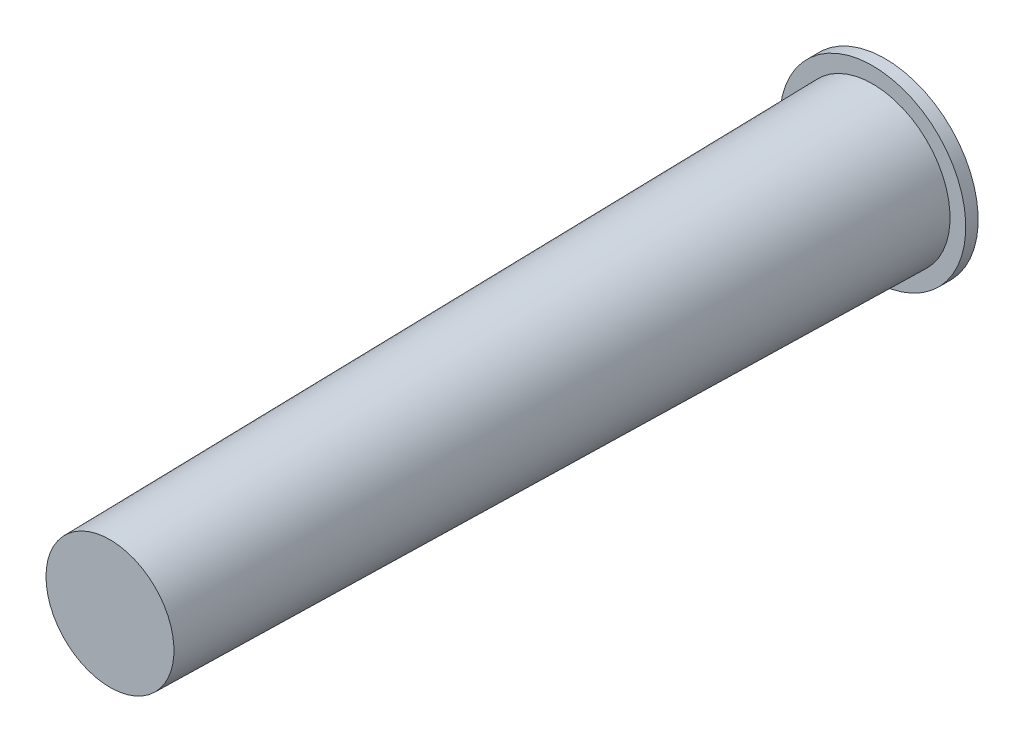
ISO-10303-21;
HEADER;
FILE_DESCRIPTION(('STEP AP214'),'2;1');
FILE_NAME('part.step','',(''),(''),'','','');
FILE_SCHEMA(('AUTOMOTIVE_DESIGN { 1 0 10303 214 1 1 1 1 }'));
ENDSEC;
DATA;
#1=APPLICATION_CONTEXT('core data for automotive mechanical design processes');
#2=APPLICATION_PROTOCOL_DEFINITION('international standard','automotive_design',2000,#1);
#3=PRODUCT_CONTEXT('',#1,'mechanical');
#4=PRODUCT('Part','Part','',(#3));
#5=PRODUCT_RELATED_PRODUCT_CATEGORY('part','',(#4));
#6=PRODUCT_DEFINITION_FORMATION('','',#4);
#7=PRODUCT_DEFINITION_CONTEXT('part definition',#1,'design');
#8=PRODUCT_DEFINITION('design','',#6,#7);
#9=PRODUCT_DEFINITION_SHAPE('','',#8);
#10=(LENGTH_UNIT() NAMED_UNIT(*) SI_UNIT(.MILLI.,.METRE.));
#11=(NAMED_UNIT(*) PLANE_ANGLE_UNIT() SI_UNIT($,.RADIAN.));
#12=(NAMED_UNIT(*) SI_UNIT($,.STERADIAN.) SOLID_ANGLE_UNIT());
#13=UNCERTAINTY_MEASURE_WITH_UNIT(LENGTH_MEASURE(1.E-05),#10,'distance_accuracy_value','');
#14=(GEOMETRIC_REPRESENTATION_CONTEXT(3) GLOBAL_UNCERTAINTY_ASSIGNED_CONTEXT((#13)) GLOBAL_UNIT_ASSIGNED_CONTEXT((#10,
#11,#12)) REPRESENTATION_CONTEXT('',''));
#15=CARTESIAN_POINT('',(0.,0.,0.));
#16=DIRECTION('',(0.,0.,1.));
#17=DIRECTION('',(1.,0.,0.));
#18=AXIS2_PLACEMENT_3D('',#15,#16,#17);
#19=CARTESIAN_POINT('',(0.,0.,47.));
#20=DIRECTION('',(0.,0.,1.));
#21=DIRECTION('',(1.,0.,0.));
#22=AXIS2_PLACEMENT_3D('',#19,#20,#21);
#23=PLANE('',#22);
#24=CARTESIAN_POINT('',(0.,0.,47.));
#25=DIRECTION('',(0.,0.,1.));
#26=DIRECTION('',(1.,0.,0.));
#27=AXIS2_PLACEMENT_3D('',#24,#25,#26);
#28=CIRCLE('',#27,3.2);
#29=CARTESIAN_POINT('',(3.2,0.,47.));
#30=VERTEX_POINT('',#29);
#31=EDGE_CURVE('E17',#30,#30,#28,.F.);
#32=ORIENTED_EDGE('',*,*,#31,.T.);
#33=EDGE_LOOP('',(#32));
#34=FACE_BOUND('',#33,.T.);
#35=ADVANCED_FACE('F14',(#34),#23,.F.);
#36=CARTESIAN_POINT('',(0.,0.,5.94903320081219));
#37=DIRECTION('',(0.,0.,1.));
#38=DIRECTION('',(1.,0.,0.));
#39=AXIS2_PLACEMENT_3D('',#36,#37,#38);
#40=CYLINDRICAL_SURFACE('',#39,3.2);
#41=CARTESIAN_POINT('',(0.,0.,18.));
#42=DIRECTION('',(0.,0.,1.));
#43=DIRECTION('',(1.,0.,0.));
#44=AXIS2_PLACEMENT_3D('',#41,#42,#43);
#45=CIRCLE('',#44,3.2);
#46=CARTESIAN_POINT('',(3.2,0.,18.));
#47=VERTEX_POINT('',#46);
#48=EDGE_CURVE('E45',#47,#47,#45,.T.);
#49=ORIENTED_EDGE('',*,*,#48,.F.);
#50=EDGE_LOOP('',(#49));
#51=FACE_BOUND('',#50,.T.);
#52=ORIENTED_EDGE('',*,*,#31,.F.);
#53=EDGE_LOOP('',(#52));
#54=FACE_BOUND('',#53,.T.);
#55=ADVANCED_FACE('F53',(#51,#54),#40,.F.);
#56=CARTESIAN_POINT('',(0.,0.,18.));
#57=DIRECTION('',(0.,0.,1.));
#58=DIRECTION('',(1.,0.,0.));
#59=AXIS2_PLACEMENT_3D('',#56,#57,#58);
#60=PLANE('',#59);
#61=ORIENTED_EDGE('',*,*,#48,.T.);
#62=EDGE_LOOP('',(#61));
#63=FACE_BOUND('',#62,.T.);
#64=CARTESIAN_POINT('',(0.,0.,18.));
#65=DIRECTION('',(0.,0.,-1.));
#66=DIRECTION('',(-1.,0.,0.));
#67=AXIS2_PLACEMENT_3D('',#64,#65,#66);
#68=CIRCLE('',#67,1.);
#69=CARTESIAN_POINT('',(-1.,0.,18.));
#70=VERTEX_POINT('',#69);
#71=EDGE_CURVE('E43',#70,#70,#68,.T.);
#72=ORIENTED_EDGE('',*,*,#71,.T.);
#73=EDGE_LOOP('',(#72));
#74=FACE_BOUND('',#73,.T.);
#75=ADVANCED_FACE('F55',(#63,#74),#60,.T.);
#76=CARTESIAN_POINT('',(0.,0.,28.5));
#77=DIRECTION('',(0.,0.,-1.));
#78=DIRECTION('',(-1.,0.,0.));
#79=AXIS2_PLACEMENT_3D('',#76,#77,#78);
#80=CYLINDRICAL_SURFACE('',#79,1.);
#81=CARTESIAN_POINT('',(0.,0.,15.));
#82=DIRECTION('',(0.,0.,-1.));
#83=DIRECTION('',(-1.,0.,0.));
#84=AXIS2_PLACEMENT_3D('',#81,#82,#83);
#85=CIRCLE('',#84,1.);
#86=CARTESIAN_POINT('',(-1.,0.,15.));
#87=VERTEX_POINT('',#86);
#88=EDGE_CURVE('E40',#87,#87,#85,.T.);
#89=ORIENTED_EDGE('',*,*,#88,.T.);
#90=EDGE_LOOP('',(#89));
#91=FACE_BOUND('',#90,.T.);
#92=ORIENTED_EDGE('',*,*,#71,.F.);
#93=EDGE_LOOP('',(#92));
#94=FACE_BOUND('',#93,.T.);
#95=ADVANCED_FACE('F62',(#91,#94),#80,.F.);
#96=CARTESIAN_POINT('',(0.,0.,15.));
#97=DIRECTION('',(0.,0.,1.));
#98=DIRECTION('',(1.,0.,0.));
#99=AXIS2_PLACEMENT_3D('',#96,#97,#98);
#100=PLANE('',#99);
#101=ORIENTED_EDGE('',*,*,#88,.F.);
#102=EDGE_LOOP('',(#101));
#103=FACE_BOUND('',#102,.T.);
#104=CARTESIAN_POINT('',(0.,0.,15.));
#105=DIRECTION('',(0.,0.,-1.));
#106=DIRECTION('',(-1.,0.,0.));
#107=AXIS2_PLACEMENT_3D('',#104,#105,#106);
#108=CIRCLE('',#107,3.2);
#109=CARTESIAN_POINT('',(-3.2,0.,15.));
#110=VERTEX_POINT('',#109);
#111=EDGE_CURVE('E37',#110,#110,#108,.T.);
#112=ORIENTED_EDGE('',*,*,#111,.T.);
#113=EDGE_LOOP('',(#112));
#114=FACE_BOUND('',#113,.T.);
#115=ADVANCED_FACE('F90',(#103,#114),#100,.F.);
#116=CARTESIAN_POINT('',(0.,0.,15.));
#117=DIRECTION('',(0.,0.,-1.));
#118=DIRECTION('',(-1.,0.,0.));
#119=AXIS2_PLACEMENT_3D('',#116,#117,#118);
#120=CYLINDRICAL_SURFACE('',#119,3.2);
#121=ORIENTED_EDGE('',*,*,#111,.F.);
#122=EDGE_LOOP('',(#121));
#123=FACE_BOUND('',#122,.T.);
#124=CARTESIAN_POINT('',(0.,0.,0.));
#125=DIRECTION('',(0.,0.,-1.));
#126=DIRECTION('',(-1.,0.,0.));
#127=AXIS2_PLACEMENT_3D('',#124,#125,#126);
#128=CIRCLE('',#127,3.2);
#129=CARTESIAN_POINT('',(-3.2,0.,0.));
#130=VERTEX_POINT('',#129);
#131=EDGE_CURVE('E34',#130,#130,#128,.T.);
#132=ORIENTED_EDGE('',*,*,#131,.T.);
#133=EDGE_LOOP('',(#132));
#134=FACE_BOUND('',#133,.T.);
#135=ADVANCED_FACE('F86',(#123,#134),#120,.F.);
#136=CARTESIAN_POINT('',(0.,0.,0.));
#137=DIRECTION('',(0.,0.,1.));
#138=DIRECTION('',(1.,0.,0.));
#139=AXIS2_PLACEMENT_3D('',#136,#137,#138);
#140=PLANE('',#139);
#141=ORIENTED_EDGE('',*,*,#131,.F.);
#142=EDGE_LOOP('',(#141));
#143=FACE_BOUND('',#142,.T.);
#144=CARTESIAN_POINT('',(0.,0.,0.));
#145=DIRECTION('',(0.,0.,-1.));
#146=DIRECTION('',(-1.,0.,0.));
#147=AXIS2_PLACEMENT_3D('',#144,#145,#146);
#148=CIRCLE('',#147,6.);
#149=CARTESIAN_POINT('',(-6.,0.,0.));
#150=VERTEX_POINT('',#149);
#151=EDGE_CURVE('E31',#150,#150,#148,.F.);
#152=ORIENTED_EDGE('',*,*,#151,.F.);
#153=EDGE_LOOP('',(#152));
#154=FACE_BOUND('',#153,.T.);
#155=ADVANCED_FACE('F82',(#143,#154),#140,.F.);
#156=CARTESIAN_POINT('',(0.,0.,0.8));
#157=DIRECTION('',(0.,0.,-1.));
#158=DIRECTION('',(-1.,0.,0.));
#159=AXIS2_PLACEMENT_3D('',#156,#157,#158);
#160=CYLINDRICAL_SURFACE('',#159,6.);
#161=ORIENTED_EDGE('',*,*,#151,.T.);
#162=EDGE_LOOP('',(#161));
#163=FACE_BOUND('',#162,.T.);
#164=CARTESIAN_POINT('',(0.,0.,0.8));
#165=DIRECTION('',(0.,0.,-1.));
#166=DIRECTION('',(-1.,0.,0.));
#167=AXIS2_PLACEMENT_3D('',#164,#165,#166);
#168=CIRCLE('',#167,6.);
#169=CARTESIAN_POINT('',(-6.,0.,0.8));
#170=VERTEX_POINT('',#169);
#171=EDGE_CURVE('E26',#170,#170,#168,.T.);
#172=ORIENTED_EDGE('',*,*,#171,.T.);
#173=EDGE_LOOP('',(#172));
#174=FACE_BOUND('',#173,.T.);
#175=ADVANCED_FACE('F78',(#163,#174),#160,.T.);
#176=CARTESIAN_POINT('',(0.,0.,50.));
#177=DIRECTION('',(0.,0.,1.));
#178=DIRECTION('',(1.,0.,0.));
#179=AXIS2_PLACEMENT_3D('',#176,#177,#178);
#180=PLANE('',#179);
#181=CARTESIAN_POINT('',(0.,0.,50.0000000000114));
#182=DIRECTION('',(0.,0.,-1.));
#183=DIRECTION('',(-1.,0.,0.));
#184=AXIS2_PLACEMENT_3D('',#181,#182,#183);
#185=CIRCLE('',#184,4.12724675358987);
#186=CARTESIAN_POINT('',(-4.12724675358987,0.,50.0000000000114));
#187=VERTEX_POINT('',#186);
#188=EDGE_CURVE('E21',#187,#187,#185,.T.);
#189=ORIENTED_EDGE('',*,*,#188,.F.);
#190=EDGE_LOOP('',(#189));
#191=FACE_BOUND('',#190,.T.);
#192=ADVANCED_FACE('F71',(#191),#180,.T.);
#193=CARTESIAN_POINT('',(0.,0.,0.8));
#194=DIRECTION('',(0.,0.,-1.));
#195=DIRECTION('',(-1.,0.,0.));
#196=AXIS2_PLACEMENT_3D('',#193,#194,#195);
#197=PLANE('',#196);
#198=CARTESIAN_POINT('',(0.,0.,0.800000000026557));
#199=DIRECTION('',(0.,0.,-1.));
#200=DIRECTION('',(-1.,0.,0.));
#201=AXIS2_PLACEMENT_3D('',#198,#199,#200);
#202=CIRCLE('',#201,4.98603594805878);
#203=CARTESIAN_POINT('',(-4.98603594805878,0.,0.800000000026557));
#204=VERTEX_POINT('',#203);
#205=EDGE_CURVE('E9',#204,#204,#202,.F.);
#206=ORIENTED_EDGE('',*,*,#205,.F.);
#207=EDGE_LOOP('',(#206));
#208=FACE_BOUND('',#207,.T.);
#209=ORIENTED_EDGE('',*,*,#171,.F.);
#210=EDGE_LOOP('',(#209));
#211=FACE_BOUND('',#210,.T.);
#212=ADVANCED_FACE('F66',(#208,#211),#197,.F.);
#213=CARTESIAN_POINT('',(0.,0.,0.800000000197088));
#214=DIRECTION('',(0.,0.,-1.));
#215=DIRECTION('',(-1.,0.,0.));
#216=AXIS2_PLACEMENT_3D('',#213,#214,#215);
#217=CONICAL_SURFACE('',#216,4.9860359480558,0.017453292519961);
#218=ORIENTED_EDGE('',*,*,#205,.T.);
#219=EDGE_LOOP('',(#218));
#220=FACE_BOUND('',#219,.T.);
#221=ORIENTED_EDGE('',*,*,#188,.T.);
#222=EDGE_LOOP('',(#221));
#223=FACE_BOUND('',#222,.T.);
#224=ADVANCED_FACE('F64',(#220,#223),#217,.T.);
#225=CLOSED_SHELL('',(#35,#55,#75,#95,#115,#135,#155,#175,#192,#212,#224));
#226=MANIFOLD_SOLID_BREP('B1',#225);
#227=ADVANCED_BREP_SHAPE_REPRESENTATION('',(#18,#226),#14);
#228=SHAPE_DEFINITION_REPRESENTATION(#9,#227);
ENDSEC;
END-ISO-10303-21;
